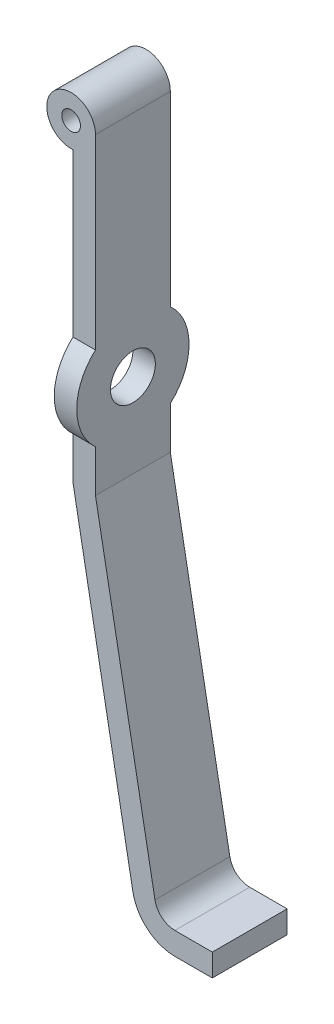
ISO-10303-21;
HEADER;
FILE_DESCRIPTION(('STEP AP214'),'2;1');
FILE_NAME('part.step','',(''),(''),'','','');
FILE_SCHEMA(('AUTOMOTIVE_DESIGN { 1 0 10303 214 1 1 1 1 }'));
ENDSEC;
DATA;
#1=APPLICATION_CONTEXT('core data for automotive mechanical design processes');
#2=APPLICATION_PROTOCOL_DEFINITION('international standard','automotive_design',2000,#1);
#3=PRODUCT_CONTEXT('',#1,'mechanical');
#4=PRODUCT('Part','Part','',(#3));
#5=PRODUCT_RELATED_PRODUCT_CATEGORY('part','',(#4));
#6=PRODUCT_DEFINITION_FORMATION('','',#4);
#7=PRODUCT_DEFINITION_CONTEXT('part definition',#1,'design');
#8=PRODUCT_DEFINITION('design','',#6,#7);
#9=PRODUCT_DEFINITION_SHAPE('','',#8);
#10=(LENGTH_UNIT() NAMED_UNIT(*) SI_UNIT(.MILLI.,.METRE.));
#11=(NAMED_UNIT(*) PLANE_ANGLE_UNIT() SI_UNIT($,.RADIAN.));
#12=(NAMED_UNIT(*) SI_UNIT($,.STERADIAN.) SOLID_ANGLE_UNIT());
#13=UNCERTAINTY_MEASURE_WITH_UNIT(LENGTH_MEASURE(1.E-05),#10,'distance_accuracy_value','');
#14=(GEOMETRIC_REPRESENTATION_CONTEXT(3) GLOBAL_UNCERTAINTY_ASSIGNED_CONTEXT((#13)) GLOBAL_UNIT_ASSIGNED_CONTEXT((#10,
#11,#12)) REPRESENTATION_CONTEXT('',''));
#15=CARTESIAN_POINT('',(0.,0.,0.));
#16=DIRECTION('',(0.,0.,1.));
#17=DIRECTION('',(1.,0.,0.));
#18=AXIS2_PLACEMENT_3D('',#15,#16,#17);
#19=CARTESIAN_POINT('',(13.8552846257266,-84.0403703492039,10.));
#20=DIRECTION('',(0.,0.,1.));
#21=DIRECTION('',(1.,0.,0.));
#22=AXIS2_PLACEMENT_3D('',#19,#20,#21);
#23=PLANE('',#22);
#24=DIRECTION('',(-1.,0.,0.));
#25=VECTOR('',#24,1.);
#26=CARTESIAN_POINT('',(24.4632034355964,-24.9098300562505,10.));
#27=LINE('',#26,#25);
#28=CARTESIAN_POINT('',(3.25,-24.9098300562505,10.));
#29=VERTEX_POINT('',#28);
#30=CARTESIAN_POINT('',(0.250000000000003,-24.9098300562505,10.));
#31=VERTEX_POINT('',#30);
#32=EDGE_CURVE('E480',#29,#31,#27,.T.);
#33=ORIENTED_EDGE('',*,*,#32,.F.);
#34=DIRECTION('',(0.,1.,0.));
#35=VECTOR('',#34,1.);
#36=CARTESIAN_POINT('',(3.25,-41.7403703492039,10.));
#37=LINE('',#36,#35);
#38=CARTESIAN_POINT('',(3.25,0.,10.));
#39=VERTEX_POINT('',#38);
#40=EDGE_CURVE('E259',#29,#39,#37,.T.);
#41=ORIENTED_EDGE('',*,*,#40,.T.);
#42=CARTESIAN_POINT('',(0.,0.,10.));
#43=DIRECTION('',(0.,0.,1.));
#44=DIRECTION('',(1.,0.,0.));
#45=AXIS2_PLACEMENT_3D('',#42,#43,#44);
#46=CIRCLE('',#45,3.25);
#47=CARTESIAN_POINT('',(0.250000000000001,-3.24037034920393,10.));
#48=VERTEX_POINT('',#47);
#49=EDGE_CURVE('E267',#39,#48,#46,.T.);
#50=ORIENTED_EDGE('',*,*,#49,.T.);
#51=DIRECTION('',(0.,-1.,0.));
#52=VECTOR('',#51,1.);
#53=CARTESIAN_POINT('',(0.250000000000001,-3.24037034920393,10.));
#54=LINE('',#53,#52);
#55=EDGE_CURVE('E185',#48,#31,#54,.T.);
#56=ORIENTED_EDGE('',*,*,#55,.T.);
#57=EDGE_LOOP('',(#33,#41,#50,#56));
#58=FACE_BOUND('',#57,.T.);
#59=CARTESIAN_POINT('',(0.,0.,10.));
#60=DIRECTION('',(0.,0.,1.));
#61=DIRECTION('',(1.,0.,0.));
#62=AXIS2_PLACEMENT_3D('',#59,#60,#61);
#63=CIRCLE('',#62,1.25);
#64=CARTESIAN_POINT('',(1.25,0.,10.));
#65=VERTEX_POINT('',#64);
#66=EDGE_CURVE('E274',#65,#65,#63,.T.);
#67=ORIENTED_EDGE('',*,*,#66,.F.);
#68=EDGE_LOOP('',(#67));
#69=FACE_BOUND('',#68,.T.);
#70=ADVANCED_FACE('F39',(#58,#69),#23,.T.);
#71=CARTESIAN_POINT('',(13.8552846257266,-84.0403703492039,0.));
#72=DIRECTION('',(0.,0.,1.));
#73=DIRECTION('',(1.,0.,0.));
#74=AXIS2_PLACEMENT_3D('',#71,#72,#73);
#75=PLANE('',#74);
#76=CARTESIAN_POINT('',(0.,0.,0.));
#77=DIRECTION('',(0.,0.,1.));
#78=DIRECTION('',(1.,0.,0.));
#79=AXIS2_PLACEMENT_3D('',#76,#77,#78);
#80=CIRCLE('',#79,1.25);
#81=CARTESIAN_POINT('',(1.25,0.,0.));
#82=VERTEX_POINT('',#81);
#83=EDGE_CURVE('E279',#82,#82,#80,.T.);
#84=ORIENTED_EDGE('',*,*,#83,.T.);
#85=EDGE_LOOP('',(#84));
#86=FACE_BOUND('',#85,.T.);
#87=DIRECTION('',(0.,1.,0.));
#88=VECTOR('',#87,1.);
#89=CARTESIAN_POINT('',(3.25,-41.7403703492039,0.));
#90=LINE('',#89,#88);
#91=CARTESIAN_POINT('',(3.25,-24.9098300562505,0.));
#92=VERTEX_POINT('',#91);
#93=CARTESIAN_POINT('',(3.25,0.,0.));
#94=VERTEX_POINT('',#93);
#95=EDGE_CURVE('E166',#92,#94,#90,.T.);
#96=ORIENTED_EDGE('',*,*,#95,.F.);
#97=DIRECTION('',(-1.,0.,0.));
#98=VECTOR('',#97,1.);
#99=CARTESIAN_POINT('',(24.4632034355964,-24.9098300562505,0.));
#100=LINE('',#99,#98);
#101=CARTESIAN_POINT('',(0.250000000000004,-24.9098300562505,0.));
#102=VERTEX_POINT('',#101);
#103=EDGE_CURVE('E144',#92,#102,#100,.T.);
#104=ORIENTED_EDGE('',*,*,#103,.T.);
#105=DIRECTION('',(0.,-1.,0.));
#106=VECTOR('',#105,1.);
#107=CARTESIAN_POINT('',(0.250000000000001,-3.24037034920393,0.));
#108=LINE('',#107,#106);
#109=CARTESIAN_POINT('',(0.250000000000001,-3.24037034920393,0.));
#110=VERTEX_POINT('',#109);
#111=EDGE_CURVE('E175',#110,#102,#108,.T.);
#112=ORIENTED_EDGE('',*,*,#111,.F.);
#113=CARTESIAN_POINT('',(0.,0.,0.));
#114=DIRECTION('',(0.,0.,1.));
#115=DIRECTION('',(1.,0.,0.));
#116=AXIS2_PLACEMENT_3D('',#113,#114,#115);
#117=CIRCLE('',#116,3.25);
#118=EDGE_CURVE('E165',#94,#110,#117,.T.);
#119=ORIENTED_EDGE('',*,*,#118,.F.);
#120=EDGE_LOOP('',(#96,#104,#112,#119));
#121=FACE_BOUND('',#120,.T.);
#122=ADVANCED_FACE('F312',(#86,#121),#75,.F.);
#123=DIRECTION('',(-1.,0.,0.));
#124=VECTOR('',#123,1.);
#125=CARTESIAN_POINT('',(24.4632034355964,-36.0901699437495,10.));
#126=LINE('',#125,#124);
#127=CARTESIAN_POINT('',(0.250000000000004,-36.0901699437495,10.));
#128=VERTEX_POINT('',#127);
#129=CARTESIAN_POINT('',(3.25,-36.0901699437495,10.));
#130=VERTEX_POINT('',#129);
#131=EDGE_CURVE('E463',#128,#130,#126,.F.);
#132=ORIENTED_EDGE('',*,*,#131,.F.);
#133=CARTESIAN_POINT('',(0.250000000000006,-41.7403703492039,10.));
#134=VERTEX_POINT('',#133);
#135=EDGE_CURVE('E270',#128,#134,#54,.T.);
#136=ORIENTED_EDGE('',*,*,#135,.T.);
#137=DIRECTION('',(0.181541589901783,-0.983383267671325,0.));
#138=VECTOR('',#137,1.);
#139=CARTESIAN_POINT('',(0.250000000000006,-41.7403703492039,10.));
#140=LINE('',#139,#138);
#141=CARTESIAN_POINT('',(8.25000000000001,-85.0751574116441,10.));
#142=VERTEX_POINT('',#141);
#143=EDGE_CURVE('E179',#134,#142,#140,.T.);
#144=ORIENTED_EDGE('',*,*,#143,.T.);
#145=CARTESIAN_POINT('',(13.8552846257266,-84.0403703492039,10.));
#146=DIRECTION('',(0.,0.,1.));
#147=DIRECTION('',(1.,0.,0.));
#148=AXIS2_PLACEMENT_3D('',#145,#146,#147);
#149=CIRCLE('',#148,5.7);
#150=CARTESIAN_POINT('',(13.8552846257266,-89.7403703492039,10.));
#151=VERTEX_POINT('',#150);
#152=EDGE_CURVE('E293',#142,#151,#149,.T.);
#153=ORIENTED_EDGE('',*,*,#152,.T.);
#154=DIRECTION('',(1.,0.,0.));
#155=VECTOR('',#154,1.);
#156=CARTESIAN_POINT('',(18.8552846257266,-89.7403703492039,10.));
#157=LINE('',#156,#155);
#158=CARTESIAN_POINT('',(18.8552846257266,-89.7403703492039,10.));
#159=VERTEX_POINT('',#158);
#160=EDGE_CURVE('E219',#151,#159,#157,.T.);
#161=ORIENTED_EDGE('',*,*,#160,.T.);
#162=DIRECTION('',(0.,1.,0.));
#163=VECTOR('',#162,1.);
#164=CARTESIAN_POINT('',(18.8552846257266,-86.7403703492039,10.));
#165=LINE('',#164,#163);
#166=CARTESIAN_POINT('',(18.8552846257266,-86.7403703492039,10.));
#167=VERTEX_POINT('',#166);
#168=EDGE_CURVE('E261',#159,#167,#165,.T.);
#169=ORIENTED_EDGE('',*,*,#168,.T.);
#170=DIRECTION('',(-1.,0.,0.));
#171=VECTOR('',#170,1.);
#172=CARTESIAN_POINT('',(13.8552846257266,-86.7403703492039,10.));
#173=LINE('',#172,#171);
#174=CARTESIAN_POINT('',(13.8552846257266,-86.7403703492039,10.));
#175=VERTEX_POINT('',#174);
#176=EDGE_CURVE('E255',#167,#175,#173,.T.);
#177=ORIENTED_EDGE('',*,*,#176,.T.);
#178=CARTESIAN_POINT('',(13.8552846257266,-84.0403703492039,10.));
#179=DIRECTION('',(0.,0.,-1.));
#180=DIRECTION('',(1.,0.,0.));
#181=AXIS2_PLACEMENT_3D('',#178,#179,#180);
#182=CIRCLE('',#181,2.7);
#183=CARTESIAN_POINT('',(11.2007129519146,-84.5335733789951,10.));
#184=VERTEX_POINT('',#183);
#185=EDGE_CURVE('E252',#175,#184,#182,.T.);
#186=ORIENTED_EDGE('',*,*,#185,.T.);
#187=DIRECTION('',(-0.18266778881155,0.983174694004427,0.));
#188=VECTOR('',#187,1.);
#189=CARTESIAN_POINT('',(3.25,-41.7403703492039,10.));
#190=LINE('',#189,#188);
#191=CARTESIAN_POINT('',(3.25,-41.7403703492039,10.));
#192=VERTEX_POINT('',#191);
#193=EDGE_CURVE('E254',#184,#192,#190,.T.);
#194=ORIENTED_EDGE('',*,*,#193,.T.);
#195=EDGE_CURVE('E55',#192,#130,#37,.T.);
#196=ORIENTED_EDGE('',*,*,#195,.T.);
#197=EDGE_LOOP('',(#132,#136,#144,#153,#161,#169,#177,#186,#194,#196));
#198=FACE_BOUND('',#197,.T.);
#199=ADVANCED_FACE('F299',(#198),#23,.T.);
#200=CARTESIAN_POINT('',(0.250000000000005,-36.0901699437495,0.));
#201=VERTEX_POINT('',#200);
#202=CARTESIAN_POINT('',(0.250000000000006,-41.7403703492039,0.));
#203=VERTEX_POINT('',#202);
#204=EDGE_CURVE('E156',#201,#203,#108,.T.);
#205=ORIENTED_EDGE('',*,*,#204,.F.);
#206=DIRECTION('',(-1.,0.,0.));
#207=VECTOR('',#206,1.);
#208=CARTESIAN_POINT('',(24.4632034355964,-36.0901699437495,0.));
#209=LINE('',#208,#207);
#210=CARTESIAN_POINT('',(3.25,-36.0901699437495,0.));
#211=VERTEX_POINT('',#210);
#212=EDGE_CURVE('E141',#201,#211,#209,.F.);
#213=ORIENTED_EDGE('',*,*,#212,.T.);
#214=CARTESIAN_POINT('',(3.25,-41.7403703492039,0.));
#215=VERTEX_POINT('',#214);
#216=EDGE_CURVE('E154',#215,#211,#90,.T.);
#217=ORIENTED_EDGE('',*,*,#216,.F.);
#218=DIRECTION('',(-0.18266778881155,0.983174694004427,0.));
#219=VECTOR('',#218,1.);
#220=CARTESIAN_POINT('',(3.25,-41.7403703492039,0.));
#221=LINE('',#220,#219);
#222=CARTESIAN_POINT('',(11.2007129519146,-84.5335733789951,0.));
#223=VERTEX_POINT('',#222);
#224=EDGE_CURVE('E171',#223,#215,#221,.T.);
#225=ORIENTED_EDGE('',*,*,#224,.F.);
#226=CARTESIAN_POINT('',(13.8552846257266,-84.0403703492039,0.));
#227=DIRECTION('',(0.,0.,-1.));
#228=DIRECTION('',(1.,0.,0.));
#229=AXIS2_PLACEMENT_3D('',#226,#227,#228);
#230=CIRCLE('',#229,2.7);
#231=CARTESIAN_POINT('',(13.8552846257266,-86.7403703492039,0.));
#232=VERTEX_POINT('',#231);
#233=EDGE_CURVE('E236',#232,#223,#230,.T.);
#234=ORIENTED_EDGE('',*,*,#233,.F.);
#235=DIRECTION('',(-1.,0.,0.));
#236=VECTOR('',#235,1.);
#237=CARTESIAN_POINT('',(13.8552846257266,-86.7403703492039,0.));
#238=LINE('',#237,#236);
#239=CARTESIAN_POINT('',(18.8552846257266,-86.7403703492039,0.));
#240=VERTEX_POINT('',#239);
#241=EDGE_CURVE('E229',#240,#232,#238,.T.);
#242=ORIENTED_EDGE('',*,*,#241,.F.);
#243=DIRECTION('',(0.,1.,0.));
#244=VECTOR('',#243,1.);
#245=CARTESIAN_POINT('',(18.8552846257266,-86.7403703492039,0.));
#246=LINE('',#245,#244);
#247=CARTESIAN_POINT('',(18.8552846257266,-89.7403703492039,0.));
#248=VERTEX_POINT('',#247);
#249=EDGE_CURVE('E224',#248,#240,#246,.T.);
#250=ORIENTED_EDGE('',*,*,#249,.F.);
#251=DIRECTION('',(1.,0.,0.));
#252=VECTOR('',#251,1.);
#253=CARTESIAN_POINT('',(18.8552846257266,-89.7403703492039,0.));
#254=LINE('',#253,#252);
#255=CARTESIAN_POINT('',(13.8552846257266,-89.7403703492039,0.));
#256=VERTEX_POINT('',#255);
#257=EDGE_CURVE('E218',#256,#248,#254,.T.);
#258=ORIENTED_EDGE('',*,*,#257,.F.);
#259=CARTESIAN_POINT('',(13.8552846257266,-84.0403703492039,0.));
#260=DIRECTION('',(0.,0.,1.));
#261=DIRECTION('',(1.,0.,0.));
#262=AXIS2_PLACEMENT_3D('',#259,#260,#261);
#263=CIRCLE('',#262,5.7);
#264=CARTESIAN_POINT('',(8.25000000000001,-85.0751574116441,0.));
#265=VERTEX_POINT('',#264);
#266=EDGE_CURVE('E222',#265,#256,#263,.T.);
#267=ORIENTED_EDGE('',*,*,#266,.F.);
#268=DIRECTION('',(0.181541589901783,-0.983383267671325,0.));
#269=VECTOR('',#268,1.);
#270=CARTESIAN_POINT('',(0.250000000000006,-41.7403703492039,0.));
#271=LINE('',#270,#269);
#272=EDGE_CURVE('E231',#203,#265,#271,.T.);
#273=ORIENTED_EDGE('',*,*,#272,.F.);
#274=EDGE_LOOP('',(#205,#213,#217,#225,#234,#242,#250,#258,#267,#273));
#275=FACE_BOUND('',#274,.T.);
#276=ADVANCED_FACE('F152',(#275),#75,.F.);
#277=CARTESIAN_POINT('',(0.250000000000006,-41.7403703492039,10.));
#278=DIRECTION('',(0.983383267671325,0.181541589901783,0.));
#279=DIRECTION('',(-0.181541589901783,0.983383267671325,0.));
#280=AXIS2_PLACEMENT_3D('',#277,#278,#279);
#281=PLANE('',#280);
#282=ORIENTED_EDGE('',*,*,#272,.T.);
#283=DIRECTION('',(0.,0.,-1.));
#284=VECTOR('',#283,1.);
#285=CARTESIAN_POINT('',(8.25000000000001,-85.0751574116441,10.));
#286=LINE('',#285,#284);
#287=EDGE_CURVE('E11',#142,#265,#286,.T.);
#288=ORIENTED_EDGE('',*,*,#287,.F.);
#289=ORIENTED_EDGE('',*,*,#143,.F.);
#290=DIRECTION('',(0.,0.,-1.));
#291=VECTOR('',#290,1.);
#292=CARTESIAN_POINT('',(0.250000000000006,-41.7403703492039,10.));
#293=LINE('',#292,#291);
#294=EDGE_CURVE('E180',#134,#203,#293,.T.);
#295=ORIENTED_EDGE('',*,*,#294,.T.);
#296=EDGE_LOOP('',(#282,#288,#289,#295));
#297=FACE_BOUND('',#296,.T.);
#298=ADVANCED_FACE('F41',(#297),#281,.F.);
#299=CARTESIAN_POINT('',(13.8552846257266,-84.0403703492039,10.));
#300=DIRECTION('',(0.,0.,-1.));
#301=DIRECTION('',(-1.,0.,0.));
#302=AXIS2_PLACEMENT_3D('',#299,#300,#301);
#303=CYLINDRICAL_SURFACE('',#302,5.7);
#304=ORIENTED_EDGE('',*,*,#266,.T.);
#305=DIRECTION('',(0.,0.,-1.));
#306=VECTOR('',#305,1.);
#307=CARTESIAN_POINT('',(13.8552846257266,-89.7403703492039,10.));
#308=LINE('',#307,#306);
#309=EDGE_CURVE('E48',#151,#256,#308,.T.);
#310=ORIENTED_EDGE('',*,*,#309,.F.);
#311=ORIENTED_EDGE('',*,*,#152,.F.);
#312=ORIENTED_EDGE('',*,*,#287,.T.);
#313=EDGE_LOOP('',(#304,#310,#311,#312));
#314=FACE_BOUND('',#313,.T.);
#315=ADVANCED_FACE('F309',(#314),#303,.T.);
#316=CARTESIAN_POINT('',(18.8552846257266,-89.7403703492039,10.));
#317=DIRECTION('',(0.,1.,0.));
#318=DIRECTION('',(0.,0.,1.));
#319=AXIS2_PLACEMENT_3D('',#316,#317,#318);
#320=PLANE('',#319);
#321=ORIENTED_EDGE('',*,*,#257,.T.);
#322=DIRECTION('',(0.,0.,-1.));
#323=VECTOR('',#322,1.);
#324=CARTESIAN_POINT('',(18.8552846257266,-89.7403703492039,10.));
#325=LINE('',#324,#323);
#326=EDGE_CURVE('E207',#159,#248,#325,.T.);
#327=ORIENTED_EDGE('',*,*,#326,.F.);
#328=ORIENTED_EDGE('',*,*,#160,.F.);
#329=ORIENTED_EDGE('',*,*,#309,.T.);
#330=EDGE_LOOP('',(#321,#327,#328,#329));
#331=FACE_BOUND('',#330,.T.);
#332=ADVANCED_FACE('F216',(#331),#320,.F.);
#333=CARTESIAN_POINT('',(18.8552846257266,-86.7403703492039,10.));
#334=DIRECTION('',(-1.,0.,0.));
#335=DIRECTION('',(0.,0.,1.));
#336=AXIS2_PLACEMENT_3D('',#333,#334,#335);
#337=PLANE('',#336);
#338=ORIENTED_EDGE('',*,*,#249,.T.);
#339=DIRECTION('',(0.,0.,-1.));
#340=VECTOR('',#339,1.);
#341=CARTESIAN_POINT('',(18.8552846257266,-86.7403703492039,10.));
#342=LINE('',#341,#340);
#343=EDGE_CURVE('E203',#167,#240,#342,.T.);
#344=ORIENTED_EDGE('',*,*,#343,.F.);
#345=ORIENTED_EDGE('',*,*,#168,.F.);
#346=ORIENTED_EDGE('',*,*,#326,.T.);
#347=EDGE_LOOP('',(#338,#344,#345,#346));
#348=FACE_BOUND('',#347,.T.);
#349=ADVANCED_FACE('F301',(#348),#337,.F.);
#350=CARTESIAN_POINT('',(13.8552846257266,-86.7403703492039,10.));
#351=DIRECTION('',(0.,-1.,0.));
#352=DIRECTION('',(0.,0.,-1.));
#353=AXIS2_PLACEMENT_3D('',#350,#351,#352);
#354=PLANE('',#353);
#355=ORIENTED_EDGE('',*,*,#241,.T.);
#356=DIRECTION('',(0.,0.,-1.));
#357=VECTOR('',#356,1.);
#358=CARTESIAN_POINT('',(13.8552846257266,-86.7403703492039,10.));
#359=LINE('',#358,#357);
#360=EDGE_CURVE('E199',#175,#232,#359,.T.);
#361=ORIENTED_EDGE('',*,*,#360,.F.);
#362=ORIENTED_EDGE('',*,*,#176,.F.);
#363=ORIENTED_EDGE('',*,*,#343,.T.);
#364=EDGE_LOOP('',(#355,#361,#362,#363));
#365=FACE_BOUND('',#364,.T.);
#366=ADVANCED_FACE('F247',(#365),#354,.F.);
#367=CARTESIAN_POINT('',(13.8552846257266,-84.0403703492039,10.));
#368=DIRECTION('',(0.,0.,-1.));
#369=DIRECTION('',(-1.,0.,0.));
#370=AXIS2_PLACEMENT_3D('',#367,#368,#369);
#371=CYLINDRICAL_SURFACE('',#370,2.7);
#372=ORIENTED_EDGE('',*,*,#233,.T.);
#373=DIRECTION('',(0.,0.,-1.));
#374=VECTOR('',#373,1.);
#375=CARTESIAN_POINT('',(11.2007129519146,-84.5335733789951,10.));
#376=LINE('',#375,#374);
#377=EDGE_CURVE('E195',#184,#223,#376,.T.);
#378=ORIENTED_EDGE('',*,*,#377,.F.);
#379=ORIENTED_EDGE('',*,*,#185,.F.);
#380=ORIENTED_EDGE('',*,*,#360,.T.);
#381=EDGE_LOOP('',(#372,#378,#379,#380));
#382=FACE_BOUND('',#381,.T.);
#383=ADVANCED_FACE('F251',(#382),#371,.F.);
#384=CARTESIAN_POINT('',(3.25,-41.7403703492039,10.));
#385=DIRECTION('',(-0.983174694004427,-0.18266778881155,0.));
#386=DIRECTION('',(0.18266778881155,-0.983174694004427,0.));
#387=AXIS2_PLACEMENT_3D('',#384,#385,#386);
#388=PLANE('',#387);
#389=ORIENTED_EDGE('',*,*,#224,.T.);
#390=DIRECTION('',(0.,0.,-1.));
#391=VECTOR('',#390,1.);
#392=CARTESIAN_POINT('',(3.25,-41.7403703492039,10.));
#393=LINE('',#392,#391);
#394=EDGE_CURVE('E163',#192,#215,#393,.T.);
#395=ORIENTED_EDGE('',*,*,#394,.F.);
#396=ORIENTED_EDGE('',*,*,#193,.F.);
#397=ORIENTED_EDGE('',*,*,#377,.T.);
#398=EDGE_LOOP('',(#389,#395,#396,#397));
#399=FACE_BOUND('',#398,.T.);
#400=ADVANCED_FACE('F243',(#399),#388,.F.);
#401=CARTESIAN_POINT('',(3.25,-41.7403703492039,10.));
#402=DIRECTION('',(-1.,0.,0.));
#403=DIRECTION('',(0.,-1.,0.));
#404=AXIS2_PLACEMENT_3D('',#401,#402,#403);
#405=PLANE('',#404);
#406=ORIENTED_EDGE('',*,*,#216,.T.);
#407=CARTESIAN_POINT('',(3.25,-30.5,5.));
#408=DIRECTION('',(-1.,0.,0.));
#409=DIRECTION('',(0.,-1.,0.));
#410=AXIS2_PLACEMENT_3D('',#407,#408,#409);
#411=CIRCLE('',#410,7.5);
#412=EDGE_CURVE('E63',#211,#92,#411,.F.);
#413=ORIENTED_EDGE('',*,*,#412,.T.);
#414=ORIENTED_EDGE('',*,*,#95,.T.);
#415=DIRECTION('',(0.,0.,-1.));
#416=VECTOR('',#415,1.);
#417=CARTESIAN_POINT('',(3.25,0.,10.));
#418=LINE('',#417,#416);
#419=EDGE_CURVE('E189',#39,#94,#418,.T.);
#420=ORIENTED_EDGE('',*,*,#419,.F.);
#421=ORIENTED_EDGE('',*,*,#40,.F.);
#422=EDGE_CURVE('E147',#29,#130,#411,.F.);
#423=ORIENTED_EDGE('',*,*,#422,.T.);
#424=ORIENTED_EDGE('',*,*,#195,.F.);
#425=ORIENTED_EDGE('',*,*,#394,.T.);
#426=EDGE_LOOP('',(#406,#413,#414,#420,#421,#423,#424,#425));
#427=FACE_BOUND('',#426,.T.);
#428=CARTESIAN_POINT('',(3.25,-30.5,5.));
#429=DIRECTION('',(-1.,0.,0.));
#430=DIRECTION('',(0.,-1.,0.));
#431=AXIS2_PLACEMENT_3D('',#428,#429,#430);
#432=CIRCLE('',#431,3.);
#433=CARTESIAN_POINT('',(3.25,-33.5,5.));
#434=VERTEX_POINT('',#433);
#435=EDGE_CURVE('E285',#434,#434,#432,.F.);
#436=ORIENTED_EDGE('',*,*,#435,.F.);
#437=EDGE_LOOP('',(#436));
#438=FACE_BOUND('',#437,.T.);
#439=ADVANCED_FACE('F160',(#427,#438),#405,.F.);
#440=CARTESIAN_POINT('',(0.,0.,10.));
#441=DIRECTION('',(0.,0.,-1.));
#442=DIRECTION('',(-1.,0.,0.));
#443=AXIS2_PLACEMENT_3D('',#440,#441,#442);
#444=CYLINDRICAL_SURFACE('',#443,3.25);
#445=ORIENTED_EDGE('',*,*,#118,.T.);
#446=DIRECTION('',(0.,0.,-1.));
#447=VECTOR('',#446,1.);
#448=CARTESIAN_POINT('',(0.250000000000001,-3.24037034920393,10.));
#449=LINE('',#448,#447);
#450=EDGE_CURVE('E184',#48,#110,#449,.T.);
#451=ORIENTED_EDGE('',*,*,#450,.F.);
#452=ORIENTED_EDGE('',*,*,#49,.F.);
#453=ORIENTED_EDGE('',*,*,#419,.T.);
#454=EDGE_LOOP('',(#445,#451,#452,#453));
#455=FACE_BOUND('',#454,.T.);
#456=ADVANCED_FACE('F335',(#455),#444,.T.);
#457=CARTESIAN_POINT('',(0.250000000000001,-3.24037034920393,10.));
#458=DIRECTION('',(1.,0.,0.));
#459=DIRECTION('',(0.,1.,0.));
#460=AXIS2_PLACEMENT_3D('',#457,#458,#459);
#461=PLANE('',#460);
#462=ORIENTED_EDGE('',*,*,#111,.T.);
#463=CARTESIAN_POINT('',(0.250000000000004,-30.5,5.));
#464=DIRECTION('',(-1.,0.,0.));
#465=DIRECTION('',(0.,-1.,0.));
#466=AXIS2_PLACEMENT_3D('',#463,#464,#465);
#467=CIRCLE('',#466,7.5);
#468=EDGE_CURVE('E468',#102,#201,#467,.T.);
#469=ORIENTED_EDGE('',*,*,#468,.T.);
#470=ORIENTED_EDGE('',*,*,#204,.T.);
#471=ORIENTED_EDGE('',*,*,#294,.F.);
#472=ORIENTED_EDGE('',*,*,#135,.F.);
#473=EDGE_CURVE('E472',#128,#31,#467,.T.);
#474=ORIENTED_EDGE('',*,*,#473,.T.);
#475=ORIENTED_EDGE('',*,*,#55,.F.);
#476=ORIENTED_EDGE('',*,*,#450,.T.);
#477=EDGE_LOOP('',(#462,#469,#470,#471,#472,#474,#475,#476));
#478=FACE_BOUND('',#477,.T.);
#479=CARTESIAN_POINT('',(0.250000000000004,-30.5,5.));
#480=DIRECTION('',(-1.,0.,0.));
#481=DIRECTION('',(0.,-1.,0.));
#482=AXIS2_PLACEMENT_3D('',#479,#480,#481);
#483=CIRCLE('',#482,3.);
#484=CARTESIAN_POINT('',(0.250000000000005,-33.5,5.));
#485=VERTEX_POINT('',#484);
#486=EDGE_CURVE('E483',#485,#485,#483,.T.);
#487=ORIENTED_EDGE('',*,*,#486,.F.);
#488=EDGE_LOOP('',(#487));
#489=FACE_BOUND('',#488,.T.);
#490=ADVANCED_FACE('F331',(#478,#489),#461,.F.);
#491=CARTESIAN_POINT('',(0.,0.,10.));
#492=DIRECTION('',(0.,0.,-1.));
#493=DIRECTION('',(-1.,0.,0.));
#494=AXIS2_PLACEMENT_3D('',#491,#492,#493);
#495=CYLINDRICAL_SURFACE('',#494,1.25);
#496=ORIENTED_EDGE('',*,*,#66,.T.);
#497=EDGE_LOOP('',(#496));
#498=FACE_BOUND('',#497,.T.);
#499=ORIENTED_EDGE('',*,*,#83,.F.);
#500=EDGE_LOOP('',(#499));
#501=FACE_BOUND('',#500,.T.);
#502=ADVANCED_FACE('F334',(#498,#501),#495,.F.);
#503=CARTESIAN_POINT('',(18.8562846257266,-30.5,5.));
#504=DIRECTION('',(-1.,0.,0.));
#505=DIRECTION('',(0.,-1.,0.));
#506=AXIS2_PLACEMENT_3D('',#503,#504,#505);
#507=CYLINDRICAL_SURFACE('',#506,3.);
#508=ORIENTED_EDGE('',*,*,#486,.T.);
#509=EDGE_LOOP('',(#508));
#510=FACE_BOUND('',#509,.T.);
#511=ORIENTED_EDGE('',*,*,#435,.T.);
#512=EDGE_LOOP('',(#511));
#513=FACE_BOUND('',#512,.T.);
#514=ADVANCED_FACE('F372',(#510,#513),#507,.F.);
#515=CARTESIAN_POINT('',(24.4632034355964,-30.5,5.));
#516=DIRECTION('',(-1.,0.,0.));
#517=DIRECTION('',(0.,-1.,0.));
#518=AXIS2_PLACEMENT_3D('',#515,#516,#517);
#519=CYLINDRICAL_SURFACE('',#518,7.5);
#520=ORIENTED_EDGE('',*,*,#103,.F.);
#521=ORIENTED_EDGE('',*,*,#412,.F.);
#522=ORIENTED_EDGE('',*,*,#212,.F.);
#523=ORIENTED_EDGE('',*,*,#468,.F.);
#524=EDGE_LOOP('',(#520,#521,#522,#523));
#525=FACE_BOUND('',#524,.T.);
#526=ADVANCED_FACE('F140',(#525),#519,.T.);
#527=ORIENTED_EDGE('',*,*,#422,.F.);
#528=ORIENTED_EDGE('',*,*,#32,.T.);
#529=ORIENTED_EDGE('',*,*,#473,.F.);
#530=ORIENTED_EDGE('',*,*,#131,.T.);
#531=EDGE_LOOP('',(#527,#528,#529,#530));
#532=FACE_BOUND('',#531,.T.);
#533=ADVANCED_FACE('F384',(#532),#519,.T.);
#534=CLOSED_SHELL('',(#70,#122,#199,#276,#298,#315,#332,#349,#366,#383,#400,#439,#456,#490,#502,
#514,#526,#533));
#535=MANIFOLD_SOLID_BREP('B2',#534);
#536=ADVANCED_BREP_SHAPE_REPRESENTATION('',(#18,#535),#14);
#537=SHAPE_DEFINITION_REPRESENTATION(#9,#536);
ENDSEC;
END-ISO-10303-21;
